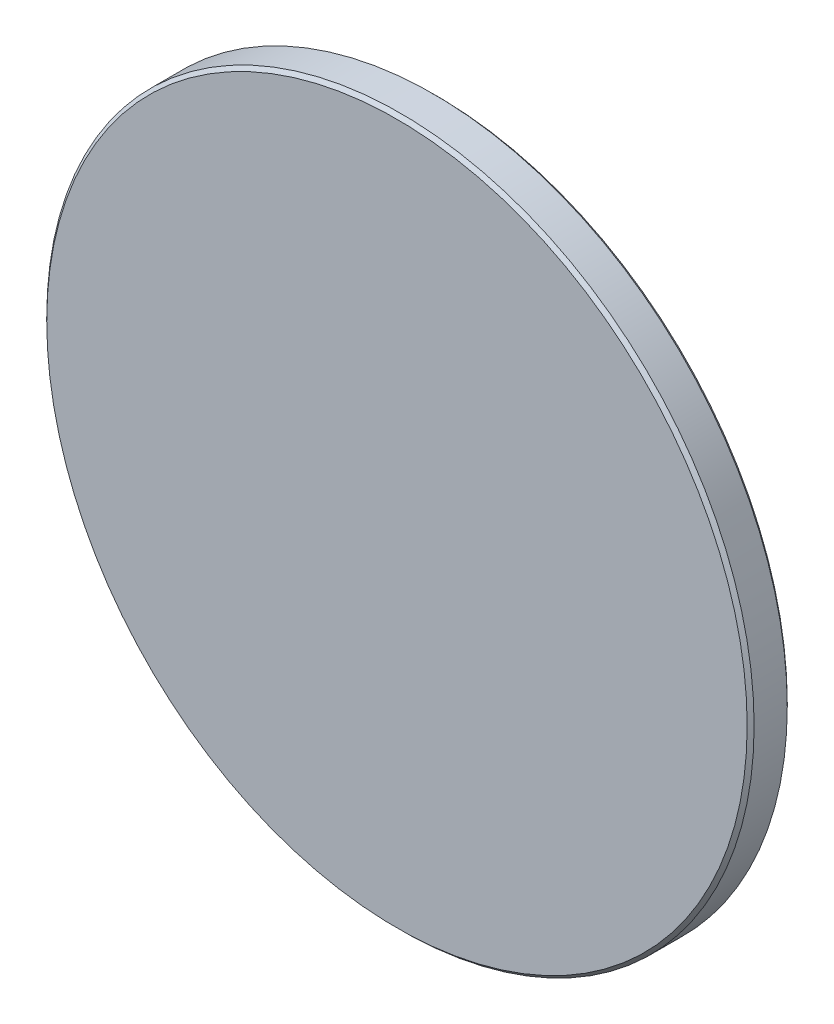
ISO-10303-21;
HEADER;
FILE_DESCRIPTION(('STEP AP214'),'2;1');
FILE_NAME('part.step','',(''),(''),'','','');
FILE_SCHEMA(('AUTOMOTIVE_DESIGN { 1 0 10303 214 1 1 1 1 }'));
ENDSEC;
DATA;
#1=APPLICATION_CONTEXT('core data for automotive mechanical design processes');
#2=APPLICATION_PROTOCOL_DEFINITION('international standard','automotive_design',2000,#1);
#3=PRODUCT_CONTEXT('',#1,'mechanical');
#4=PRODUCT('Part','Part','',(#3));
#5=PRODUCT_RELATED_PRODUCT_CATEGORY('part','',(#4));
#6=PRODUCT_DEFINITION_FORMATION('','',#4);
#7=PRODUCT_DEFINITION_CONTEXT('part definition',#1,'design');
#8=PRODUCT_DEFINITION('design','',#6,#7);
#9=PRODUCT_DEFINITION_SHAPE('','',#8);
#10=(LENGTH_UNIT() NAMED_UNIT(*) SI_UNIT(.MILLI.,.METRE.));
#11=(NAMED_UNIT(*) PLANE_ANGLE_UNIT() SI_UNIT($,.RADIAN.));
#12=(NAMED_UNIT(*) SI_UNIT($,.STERADIAN.) SOLID_ANGLE_UNIT());
#13=UNCERTAINTY_MEASURE_WITH_UNIT(LENGTH_MEASURE(1.E-05),#10,'distance_accuracy_value','');
#14=(GEOMETRIC_REPRESENTATION_CONTEXT(3) GLOBAL_UNCERTAINTY_ASSIGNED_CONTEXT((#13)) GLOBAL_UNIT_ASSIGNED_CONTEXT((#10,
#11,#12)) REPRESENTATION_CONTEXT('',''));
#15=CARTESIAN_POINT('',(0.,0.,0.));
#16=DIRECTION('',(0.,0.,1.));
#17=DIRECTION('',(1.,0.,0.));
#18=AXIS2_PLACEMENT_3D('',#15,#16,#17);
#19=CARTESIAN_POINT('',(0.,0.,1.44));
#20=DIRECTION('',(0.,0.,-1.));
#21=DIRECTION('',(-1.,0.,0.));
#22=AXIS2_PLACEMENT_3D('',#19,#20,#21);
#23=CYLINDRICAL_SURFACE('',#22,25.4);
#24=CARTESIAN_POINT('',(0.,0.,-1.18999999999998));
#25=DIRECTION('',(0.,0.,1.));
#26=DIRECTION('',(1.,0.,0.));
#27=AXIS2_PLACEMENT_3D('',#24,#25,#26);
#28=CIRCLE('',#27,25.4);
#29=CARTESIAN_POINT('',(-25.4,0.,-1.18999999999998));
#30=VERTEX_POINT('',#29);
#31=EDGE_CURVE('E28',#30,#30,#28,.T.);
#32=CARTESIAN_POINT('',(0.,0.,1.19000000000002));
#33=DIRECTION('',(0.,0.,1.));
#34=DIRECTION('',(1.,0.,0.));
#35=AXIS2_PLACEMENT_3D('',#32,#33,#34);
#36=CIRCLE('',#35,25.4);
#37=CARTESIAN_POINT('',(-25.4,0.,1.19000000000002));
#38=VERTEX_POINT('',#37);
#39=EDGE_CURVE('E32',#38,#38,#36,.F.);
#40=CARTESIAN_POINT('',(-25.4,0.,-1.18999999999998));
#41=CARTESIAN_POINT('',(-25.4,0.,-1.16520833333331));
#42=CARTESIAN_POINT('',(-25.4,0.,-1.14041666666665));
#43=CARTESIAN_POINT('',(-25.4,0.,-1.09083333333331));
#44=CARTESIAN_POINT('',(-25.4,0.,-1.06604166666665));
#45=CARTESIAN_POINT('',(-25.4,0.,-1.01645833333331));
#46=CARTESIAN_POINT('',(-25.4,0.,-0.991666666666646));
#47=CARTESIAN_POINT('',(-25.4,0.,-0.942083333333313));
#48=CARTESIAN_POINT('',(-25.4,0.,-0.917291666666646));
#49=CARTESIAN_POINT('',(-25.4,0.,-0.867708333333313));
#50=CARTESIAN_POINT('',(-25.4,0.,-0.842916666666646));
#51=CARTESIAN_POINT('',(-25.4,0.,-0.793333333333313));
#52=CARTESIAN_POINT('',(-25.4,0.,-0.768541666666646));
#53=CARTESIAN_POINT('',(-25.4,0.,-0.718958333333312));
#54=CARTESIAN_POINT('',(-25.4,0.,-0.694166666666646));
#55=CARTESIAN_POINT('',(-25.4,0.,-0.644583333333312));
#56=CARTESIAN_POINT('',(-25.4,0.,-0.619791666666646));
#57=CARTESIAN_POINT('',(-25.4,0.,-0.570208333333313));
#58=CARTESIAN_POINT('',(-25.4,0.,-0.545416666666646));
#59=CARTESIAN_POINT('',(-25.4,0.,-0.495833333333313));
#60=CARTESIAN_POINT('',(-25.4,0.,-0.471041666666646));
#61=CARTESIAN_POINT('',(-25.4,0.,-0.421458333333313));
#62=CARTESIAN_POINT('',(-25.4,0.,-0.396666666666646));
#63=CARTESIAN_POINT('',(-25.4,0.,-0.347083333333313));
#64=CARTESIAN_POINT('',(-25.4,0.,-0.322291666666646));
#65=CARTESIAN_POINT('',(-25.4,0.,-0.272708333333313));
#66=CARTESIAN_POINT('',(-25.4,0.,-0.247916666666646));
#67=CARTESIAN_POINT('',(-25.4,0.,-0.198333333333313));
#68=CARTESIAN_POINT('',(-25.4,0.,-0.173541666666646));
#69=CARTESIAN_POINT('',(-25.4,0.,-0.123958333333313));
#70=CARTESIAN_POINT('',(-25.4,0.,-0.0991666666666461));
#71=CARTESIAN_POINT('',(-25.4,0.,-0.0495833333333127));
#72=CARTESIAN_POINT('',(-25.4,0.,-0.0247916666666461));
#73=CARTESIAN_POINT('',(-25.4,0.,0.0247916666666873));
#74=CARTESIAN_POINT('',(-25.4,0.,0.0495833333333539));
#75=CARTESIAN_POINT('',(-25.4,0.,0.0991666666666873));
#76=CARTESIAN_POINT('',(-25.4,0.,0.123958333333354));
#77=CARTESIAN_POINT('',(-25.4,0.,0.173541666666687));
#78=CARTESIAN_POINT('',(-25.4,0.,0.198333333333354));
#79=CARTESIAN_POINT('',(-25.4,0.,0.247916666666687));
#80=CARTESIAN_POINT('',(-25.4,0.,0.272708333333354));
#81=CARTESIAN_POINT('',(-25.4,0.,0.322291666666687));
#82=CARTESIAN_POINT('',(-25.4,0.,0.347083333333354));
#83=CARTESIAN_POINT('',(-25.4,0.,0.396666666666687));
#84=CARTESIAN_POINT('',(-25.4,0.,0.421458333333354));
#85=CARTESIAN_POINT('',(-25.4,0.,0.471041666666687));
#86=CARTESIAN_POINT('',(-25.4,0.,0.495833333333354));
#87=CARTESIAN_POINT('',(-25.4,0.,0.545416666666687));
#88=CARTESIAN_POINT('',(-25.4,0.,0.570208333333354));
#89=CARTESIAN_POINT('',(-25.4,0.,0.619791666666687));
#90=CARTESIAN_POINT('',(-25.4,0.,0.644583333333354));
#91=CARTESIAN_POINT('',(-25.4,0.,0.694166666666687));
#92=CARTESIAN_POINT('',(-25.4,0.,0.718958333333354));
#93=CARTESIAN_POINT('',(-25.4,0.,0.768541666666687));
#94=CARTESIAN_POINT('',(-25.4,0.,0.793333333333354));
#95=CARTESIAN_POINT('',(-25.4,0.,0.842916666666687));
#96=CARTESIAN_POINT('',(-25.4,0.,0.867708333333354));
#97=CARTESIAN_POINT('',(-25.4,0.,0.917291666666687));
#98=CARTESIAN_POINT('',(-25.4,0.,0.942083333333354));
#99=CARTESIAN_POINT('',(-25.4,0.,0.991666666666687));
#100=CARTESIAN_POINT('',(-25.4,0.,1.01645833333335));
#101=CARTESIAN_POINT('',(-25.4,0.,1.06604166666669));
#102=CARTESIAN_POINT('',(-25.4,0.,1.09083333333335));
#103=CARTESIAN_POINT('',(-25.4,0.,1.14041666666669));
#104=CARTESIAN_POINT('',(-25.4,0.,1.16520833333335));
#105=CARTESIAN_POINT('',(-25.4,0.,1.19000000000002));
#106=B_SPLINE_CURVE_WITH_KNOTS('',3,(#40,#41,#42,#43,#44,#45,#46,#47,#48,#49,#50,#51,#52,#53,
#54,#55,#56,#57,#58,#59,#60,#61,#62,#63,#64,#65,#66,#67,#68,#69,#70,#71,#72,#73,#74,#75,#76,#77,
#78,#79,#80,#81,#82,#83,#84,#85,#86,#87,#88,#89,#90,#91,#92,#93,#94,#95,#96,#97,#98,#99,#100,
#101,#102,#103,#104,#105),.UNSPECIFIED.,.F.,.F.,(4,2,2,2,2,2,2,2,2,2,2,2,2,2,2,2,2,2,2,2,2,2,2,
2,2,2,2,2,2,2,2,2,4),(0.,0.0743749999999998,0.14875,0.223125,0.2975,0.371875,0.44625,0.520625,
0.595,0.669375,0.74375,0.818125,0.8925,0.966875,1.04125,1.115625,1.19,1.264375,1.33875,1.413125,
1.4875,1.561875,1.63625,1.710625,1.785,1.859375,1.93375,2.008125,2.0825,2.156875,2.23125,
2.305625,2.38),.UNSPECIFIED.);
#107=EDGE_CURVE('BSEAM17',#30,#38,#106,.T.);
#108=ORIENTED_EDGE('',*,*,#31,.T.);
#109=ORIENTED_EDGE('',*,*,#39,.T.);
#110=ORIENTED_EDGE('',*,*,#107,.T.);
#111=ORIENTED_EDGE('',*,*,#107,.F.);
#112=EDGE_LOOP('',(#108,#110,#109,#111));
#113=FACE_BOUND('',#112,.T.);
#114=ADVANCED_FACE('F17',(#113),#23,.T.);
#115=CARTESIAN_POINT('',(0.,0.,1.44));
#116=DIRECTION('',(0.,0.,1.));
#117=DIRECTION('',(1.,0.,0.));
#118=AXIS2_PLACEMENT_3D('',#115,#116,#117);
#119=PLANE('',#118);
#120=CARTESIAN_POINT('',(0.,0.,1.44));
#121=DIRECTION('',(0.,0.,1.));
#122=DIRECTION('',(1.,0.,0.));
#123=AXIS2_PLACEMENT_3D('',#120,#121,#122);
#124=CIRCLE('',#123,25.15);
#125=CARTESIAN_POINT('',(25.15,0.,1.44));
#126=VERTEX_POINT('',#125);
#127=EDGE_CURVE('E10',#126,#126,#124,.T.);
#128=ORIENTED_EDGE('',*,*,#127,.T.);
#129=EDGE_LOOP('',(#128));
#130=FACE_BOUND('',#129,.T.);
#131=ADVANCED_FACE('F49',(#130),#119,.T.);
#132=CARTESIAN_POINT('',(0.,0.,-1.44));
#133=DIRECTION('',(0.,0.,1.));
#134=DIRECTION('',(1.,0.,0.));
#135=AXIS2_PLACEMENT_3D('',#132,#133,#134);
#136=PLANE('',#135);
#137=CARTESIAN_POINT('',(0.,0.,-1.44));
#138=DIRECTION('',(0.,0.,1.));
#139=DIRECTION('',(1.,0.,0.));
#140=AXIS2_PLACEMENT_3D('',#137,#138,#139);
#141=CIRCLE('',#140,25.15);
#142=CARTESIAN_POINT('',(25.15,0.,-1.44));
#143=VERTEX_POINT('',#142);
#144=EDGE_CURVE('E24',#143,#143,#141,.F.);
#145=ORIENTED_EDGE('',*,*,#144,.T.);
#146=EDGE_LOOP('',(#145));
#147=FACE_BOUND('',#146,.T.);
#148=ADVANCED_FACE('F46',(#147),#136,.F.);
#149=CARTESIAN_POINT('',(0.,0.,-1.18999999999998));
#150=DIRECTION('',(0.,0.,1.));
#151=DIRECTION('',(1.,0.,0.));
#152=AXIS2_PLACEMENT_3D('',#149,#150,#151);
#153=CONICAL_SURFACE('',#152,25.4,0.785398163397448);
#154=ORIENTED_EDGE('',*,*,#144,.F.);
#155=EDGE_LOOP('',(#154));
#156=FACE_BOUND('',#155,.T.);
#157=ORIENTED_EDGE('',*,*,#31,.F.);
#158=EDGE_LOOP('',(#157));
#159=FACE_BOUND('',#158,.T.);
#160=ADVANCED_FACE('F41',(#156,#159),#153,.T.);
#161=CARTESIAN_POINT('',(0.,0.,1.44));
#162=DIRECTION('',(0.,0.,-1.));
#163=DIRECTION('',(-1.,0.,0.));
#164=AXIS2_PLACEMENT_3D('',#161,#162,#163);
#165=CONICAL_SURFACE('',#164,25.15,0.785398163397441);
#166=ORIENTED_EDGE('',*,*,#39,.F.);
#167=EDGE_LOOP('',(#166));
#168=FACE_BOUND('',#167,.T.);
#169=ORIENTED_EDGE('',*,*,#127,.F.);
#170=EDGE_LOOP('',(#169));
#171=FACE_BOUND('',#170,.T.);
#172=ADVANCED_FACE('F19',(#168,#171),#165,.T.);
#173=CLOSED_SHELL('',(#114,#131,#148,#160,#172));
#174=MANIFOLD_SOLID_BREP('B1',#173);
#175=ADVANCED_BREP_SHAPE_REPRESENTATION('',(#18,#174),#14);
#176=SHAPE_DEFINITION_REPRESENTATION(#9,#175);
ENDSEC;
END-ISO-10303-21;
